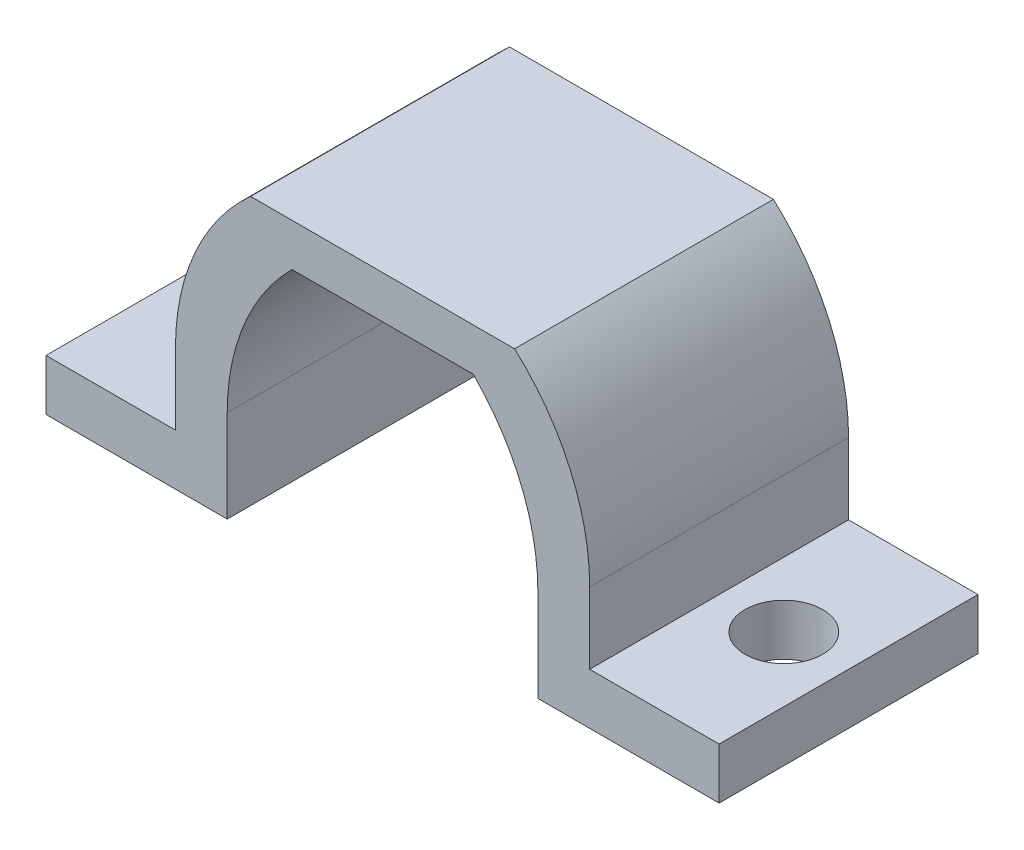
ISO-10303-21;
HEADER;
FILE_DESCRIPTION(('STEP AP214'),'2;1');
FILE_NAME('part.step','',(''),(''),'','','');
FILE_SCHEMA(('AUTOMOTIVE_DESIGN { 1 0 10303 214 1 1 1 1 }'));
ENDSEC;
DATA;
#1=APPLICATION_CONTEXT('core data for automotive mechanical design processes');
#2=APPLICATION_PROTOCOL_DEFINITION('international standard','automotive_design',2000,#1);
#3=PRODUCT_CONTEXT('',#1,'mechanical');
#4=PRODUCT('Part','Part','',(#3));
#5=PRODUCT_RELATED_PRODUCT_CATEGORY('part','',(#4));
#6=PRODUCT_DEFINITION_FORMATION('','',#4);
#7=PRODUCT_DEFINITION_CONTEXT('part definition',#1,'design');
#8=PRODUCT_DEFINITION('design','',#6,#7);
#9=PRODUCT_DEFINITION_SHAPE('','',#8);
#10=(LENGTH_UNIT() NAMED_UNIT(*) SI_UNIT(.MILLI.,.METRE.));
#11=(NAMED_UNIT(*) PLANE_ANGLE_UNIT() SI_UNIT($,.RADIAN.));
#12=(NAMED_UNIT(*) SI_UNIT($,.STERADIAN.) SOLID_ANGLE_UNIT());
#13=UNCERTAINTY_MEASURE_WITH_UNIT(LENGTH_MEASURE(1.E-05),#10,'distance_accuracy_value','');
#14=(GEOMETRIC_REPRESENTATION_CONTEXT(3) GLOBAL_UNCERTAINTY_ASSIGNED_CONTEXT((#13)) GLOBAL_UNIT_ASSIGNED_CONTEXT((#10,
#11,#12)) REPRESENTATION_CONTEXT('',''));
#15=CARTESIAN_POINT('',(0.,0.,0.));
#16=DIRECTION('',(0.,0.,1.));
#17=DIRECTION('',(1.,0.,0.));
#18=AXIS2_PLACEMENT_3D('',#15,#16,#17);
#19=CARTESIAN_POINT('',(2.1085809977943,-0.73996665713714,10.));
#20=DIRECTION('',(0.,0.,-1.));
#21=DIRECTION('',(-1.,0.,0.));
#22=AXIS2_PLACEMENT_3D('',#19,#20,#21);
#23=CYLINDRICAL_SURFACE('',#22,8.77131713758343);
#24=CARTESIAN_POINT('',(2.1085809977943,-0.73996665713714,0.));
#25=DIRECTION('',(0.,0.,1.));
#26=DIRECTION('',(-1.,0.,0.));
#27=AXIS2_PLACEMENT_3D('',#24,#25,#26);
#28=CIRCLE('',#27,8.77131713758343);
#29=CARTESIAN_POINT('',(-3.76163900518998,5.77743477630456,0.));
#30=VERTEX_POINT('',#29);
#31=CARTESIAN_POINT('',(-6.66273613978913,-0.739966657137139,0.));
#32=VERTEX_POINT('',#31);
#33=EDGE_CURVE('E194',#30,#32,#28,.T.);
#34=ORIENTED_EDGE('',*,*,#33,.T.);
#35=DIRECTION('',(0.,0.,-1.));
#36=VECTOR('',#35,1.);
#37=CARTESIAN_POINT('',(-6.66273613978913,-0.739966657137139,10.));
#38=LINE('',#37,#36);
#39=CARTESIAN_POINT('',(-6.66273613978913,-0.739966657137139,10.));
#40=VERTEX_POINT('',#39);
#41=EDGE_CURVE('E11',#40,#32,#38,.T.);
#42=ORIENTED_EDGE('',*,*,#41,.F.);
#43=CARTESIAN_POINT('',(2.1085809977943,-0.73996665713714,10.));
#44=DIRECTION('',(0.,0.,1.));
#45=DIRECTION('',(-1.,0.,0.));
#46=AXIS2_PLACEMENT_3D('',#43,#44,#45);
#47=CIRCLE('',#46,8.77131713758343);
#48=CARTESIAN_POINT('',(-3.76163900518998,5.77743477630456,10.));
#49=VERTEX_POINT('',#48);
#50=EDGE_CURVE('E240',#49,#40,#47,.T.);
#51=ORIENTED_EDGE('',*,*,#50,.F.);
#52=DIRECTION('',(0.,0.,-1.));
#53=VECTOR('',#52,1.);
#54=CARTESIAN_POINT('',(-3.76163900518998,5.77743477630456,10.));
#55=LINE('',#54,#53);
#56=EDGE_CURVE('E190',#49,#30,#55,.T.);
#57=ORIENTED_EDGE('',*,*,#56,.T.);
#58=EDGE_LOOP('',(#34,#42,#51,#57));
#59=FACE_BOUND('',#58,.T.);
#60=ADVANCED_FACE('F44',(#59),#23,.T.);
#61=CARTESIAN_POINT('',(-6.66273613978913,-0.739966657137139,10.));
#62=DIRECTION('',(1.,0.,0.));
#63=DIRECTION('',(0.,1.,0.));
#64=AXIS2_PLACEMENT_3D('',#61,#62,#63);
#65=PLANE('',#64);
#66=DIRECTION('',(0.,-1.,0.));
#67=VECTOR('',#66,1.);
#68=CARTESIAN_POINT('',(-6.66273613978913,-0.739966657137139,0.));
#69=LINE('',#68,#67);
#70=CARTESIAN_POINT('',(-6.66273613978913,-3.49323763777108,0.));
#71=VERTEX_POINT('',#70);
#72=EDGE_CURVE('E198',#32,#71,#69,.T.);
#73=ORIENTED_EDGE('',*,*,#72,.T.);
#74=DIRECTION('',(0.,0.,-1.));
#75=VECTOR('',#74,1.);
#76=CARTESIAN_POINT('',(-6.66273613978913,-3.49323763777108,10.));
#77=LINE('',#76,#75);
#78=CARTESIAN_POINT('',(-6.66273613978913,-3.49323763777108,10.));
#79=VERTEX_POINT('',#78);
#80=EDGE_CURVE('E54',#79,#71,#77,.T.);
#81=ORIENTED_EDGE('',*,*,#80,.F.);
#82=DIRECTION('',(0.,-1.,0.));
#83=VECTOR('',#82,1.);
#84=CARTESIAN_POINT('',(-6.66273613978913,-0.739966657137139,10.));
#85=LINE('',#84,#83);
#86=EDGE_CURVE('E129',#40,#79,#85,.T.);
#87=ORIENTED_EDGE('',*,*,#86,.F.);
#88=ORIENTED_EDGE('',*,*,#41,.T.);
#89=EDGE_LOOP('',(#73,#81,#87,#88));
#90=FACE_BOUND('',#89,.T.);
#91=ADVANCED_FACE('F363',(#90),#65,.F.);
#92=CARTESIAN_POINT('',(-6.66273613978913,-3.49323763777108,10.));
#93=DIRECTION('',(0.,-1.,0.));
#94=DIRECTION('',(0.,0.,-1.));
#95=AXIS2_PLACEMENT_3D('',#92,#93,#94);
#96=PLANE('',#95);
#97=CARTESIAN_POINT('',(-9.16273613978912,-3.49323763777108,5.));
#98=DIRECTION('',(0.,1.,0.));
#99=DIRECTION('',(0.,0.,1.));
#100=AXIS2_PLACEMENT_3D('',#97,#98,#99);
#101=CIRCLE('',#100,1.5);
#102=CARTESIAN_POINT('',(-9.16273613978912,-3.49323763777108,6.5));
#103=VERTEX_POINT('',#102);
#104=EDGE_CURVE('E462',#103,#103,#101,.T.);
#105=ORIENTED_EDGE('',*,*,#104,.F.);
#106=EDGE_LOOP('',(#105));
#107=FACE_BOUND('',#106,.T.);
#108=DIRECTION('',(-1.,0.,0.));
#109=VECTOR('',#108,1.);
#110=CARTESIAN_POINT('',(-6.66273613978913,-3.49323763777108,0.));
#111=LINE('',#110,#109);
#112=CARTESIAN_POINT('',(-11.6627361397891,-3.49323763777108,0.));
#113=VERTEX_POINT('',#112);
#114=EDGE_CURVE('E201',#71,#113,#111,.T.);
#115=ORIENTED_EDGE('',*,*,#114,.T.);
#116=DIRECTION('',(0.,0.,-1.));
#117=VECTOR('',#116,1.);
#118=CARTESIAN_POINT('',(-11.6627361397891,-3.49323763777108,10.));
#119=LINE('',#118,#117);
#120=CARTESIAN_POINT('',(-11.6627361397891,-3.49323763777108,10.));
#121=VERTEX_POINT('',#120);
#122=EDGE_CURVE('E283',#121,#113,#119,.T.);
#123=ORIENTED_EDGE('',*,*,#122,.F.);
#124=DIRECTION('',(-1.,0.,0.));
#125=VECTOR('',#124,1.);
#126=CARTESIAN_POINT('',(-6.66273613978913,-3.49323763777108,10.));
#127=LINE('',#126,#125);
#128=EDGE_CURVE('E294',#79,#121,#127,.T.);
#129=ORIENTED_EDGE('',*,*,#128,.F.);
#130=ORIENTED_EDGE('',*,*,#80,.T.);
#131=EDGE_LOOP('',(#115,#123,#129,#130));
#132=FACE_BOUND('',#131,.T.);
#133=ADVANCED_FACE('F292',(#107,#132),#96,.F.);
#134=CARTESIAN_POINT('',(-11.6627361397891,-3.49323763777108,10.));
#135=DIRECTION('',(1.,0.,0.));
#136=DIRECTION('',(0.,1.,0.));
#137=AXIS2_PLACEMENT_3D('',#134,#135,#136);
#138=PLANE('',#137);
#139=DIRECTION('',(0.,-1.,0.));
#140=VECTOR('',#139,1.);
#141=CARTESIAN_POINT('',(-11.6627361397891,-3.49323763777108,0.));
#142=LINE('',#141,#140);
#143=CARTESIAN_POINT('',(-11.6627361397891,-5.46917917370583,0.));
#144=VERTEX_POINT('',#143);
#145=EDGE_CURVE('E204',#113,#144,#142,.T.);
#146=ORIENTED_EDGE('',*,*,#145,.T.);
#147=DIRECTION('',(0.,0.,-1.));
#148=VECTOR('',#147,1.);
#149=CARTESIAN_POINT('',(-11.6627361397891,-5.46917917370583,10.));
#150=LINE('',#149,#148);
#151=CARTESIAN_POINT('',(-11.6627361397891,-5.46917917370583,10.));
#152=VERTEX_POINT('',#151);
#153=EDGE_CURVE('E279',#152,#144,#150,.T.);
#154=ORIENTED_EDGE('',*,*,#153,.F.);
#155=DIRECTION('',(0.,-1.,0.));
#156=VECTOR('',#155,1.);
#157=CARTESIAN_POINT('',(-11.6627361397891,-3.49323763777108,10.));
#158=LINE('',#157,#156);
#159=EDGE_CURVE('E313',#121,#152,#158,.T.);
#160=ORIENTED_EDGE('',*,*,#159,.F.);
#161=ORIENTED_EDGE('',*,*,#122,.T.);
#162=EDGE_LOOP('',(#146,#154,#160,#161));
#163=FACE_BOUND('',#162,.T.);
#164=ADVANCED_FACE('F303',(#163),#138,.F.);
#165=CARTESIAN_POINT('',(-4.66273613978913,-5.46917917370583,10.));
#166=DIRECTION('',(0.,1.,0.));
#167=DIRECTION('',(-1.,0.,0.));
#168=AXIS2_PLACEMENT_3D('',#165,#166,#167);
#169=PLANE('',#168);
#170=CARTESIAN_POINT('',(-9.16273613978912,-5.46917917370583,5.));
#171=DIRECTION('',(0.,1.,0.));
#172=DIRECTION('',(-1.,0.,0.));
#173=AXIS2_PLACEMENT_3D('',#170,#171,#172);
#174=CIRCLE('',#173,1.5);
#175=CARTESIAN_POINT('',(-10.6627361397891,-5.46917917370583,5.));
#176=VERTEX_POINT('',#175);
#177=EDGE_CURVE('E47',#176,#176,#174,.T.);
#178=ORIENTED_EDGE('',*,*,#177,.T.);
#179=EDGE_LOOP('',(#178));
#180=FACE_BOUND('',#179,.T.);
#181=DIRECTION('',(1.,0.,0.));
#182=VECTOR('',#181,1.);
#183=CARTESIAN_POINT('',(-4.66273613978913,-5.46917917370583,0.));
#184=LINE('',#183,#182);
#185=CARTESIAN_POINT('',(-4.66273613978913,-5.46917917370583,0.));
#186=VERTEX_POINT('',#185);
#187=EDGE_CURVE('E207',#144,#186,#184,.T.);
#188=ORIENTED_EDGE('',*,*,#187,.T.);
#189=DIRECTION('',(0.,0.,-1.));
#190=VECTOR('',#189,1.);
#191=CARTESIAN_POINT('',(-4.66273613978913,-5.46917917370583,10.));
#192=LINE('',#191,#190);
#193=CARTESIAN_POINT('',(-4.66273613978913,-5.46917917370583,10.));
#194=VERTEX_POINT('',#193);
#195=EDGE_CURVE('E275',#194,#186,#192,.T.);
#196=ORIENTED_EDGE('',*,*,#195,.F.);
#197=DIRECTION('',(1.,0.,0.));
#198=VECTOR('',#197,1.);
#199=CARTESIAN_POINT('',(-4.66273613978913,-5.46917917370583,10.));
#200=LINE('',#199,#198);
#201=EDGE_CURVE('E309',#152,#194,#200,.T.);
#202=ORIENTED_EDGE('',*,*,#201,.F.);
#203=ORIENTED_EDGE('',*,*,#153,.T.);
#204=EDGE_LOOP('',(#188,#196,#202,#203));
#205=FACE_BOUND('',#204,.T.);
#206=ADVANCED_FACE('F307',(#180,#205),#169,.F.);
#207=CARTESIAN_POINT('',(-4.66273613978913,-5.46917917370583,10.));
#208=DIRECTION('',(-1.,0.,0.));
#209=DIRECTION('',(0.,0.,1.));
#210=AXIS2_PLACEMENT_3D('',#207,#208,#209);
#211=PLANE('',#210);
#212=DIRECTION('',(0.,1.,0.));
#213=VECTOR('',#212,1.);
#214=CARTESIAN_POINT('',(-4.66273613978913,-5.46917917370583,0.));
#215=LINE('',#214,#213);
#216=CARTESIAN_POINT('',(-4.66273613978913,-1.9075561157816,0.));
#217=VERTEX_POINT('',#216);
#218=EDGE_CURVE('E210',#186,#217,#215,.T.);
#219=ORIENTED_EDGE('',*,*,#218,.T.);
#220=DIRECTION('',(0.,0.,-1.));
#221=VECTOR('',#220,1.);
#222=CARTESIAN_POINT('',(-4.66273613978913,-1.9075561157816,10.));
#223=LINE('',#222,#221);
#224=CARTESIAN_POINT('',(-4.66273613978913,-1.9075561157816,10.));
#225=VERTEX_POINT('',#224);
#226=EDGE_CURVE('E271',#225,#217,#223,.T.);
#227=ORIENTED_EDGE('',*,*,#226,.F.);
#228=DIRECTION('',(0.,1.,0.));
#229=VECTOR('',#228,1.);
#230=CARTESIAN_POINT('',(-4.66273613978913,-5.46917917370583,10.));
#231=LINE('',#230,#229);
#232=EDGE_CURVE('E312',#194,#225,#231,.T.);
#233=ORIENTED_EDGE('',*,*,#232,.F.);
#234=ORIENTED_EDGE('',*,*,#195,.T.);
#235=EDGE_LOOP('',(#219,#227,#233,#234));
#236=FACE_BOUND('',#235,.T.);
#237=ADVANCED_FACE('F377',(#236),#211,.F.);
#238=CARTESIAN_POINT('',(3.87966307912934,-1.9075561157816,10.));
#239=DIRECTION('',(0.,0.,-1.));
#240=DIRECTION('',(-1.,0.,0.));
#241=AXIS2_PLACEMENT_3D('',#238,#239,#240);
#242=CYLINDRICAL_SURFACE('',#241,8.54239921891846);
#243=CARTESIAN_POINT('',(3.87966307912934,-1.9075561157816,0.));
#244=DIRECTION('',(0.,0.,-1.));
#245=DIRECTION('',(-1.,0.,0.));
#246=AXIS2_PLACEMENT_3D('',#243,#244,#245);
#247=CIRCLE('',#246,8.54239921891846);
#248=CARTESIAN_POINT('',(-2.16273613978913,4.13082082629417,0.));
#249=VERTEX_POINT('',#248);
#250=EDGE_CURVE('E213',#217,#249,#247,.T.);
#251=ORIENTED_EDGE('',*,*,#250,.T.);
#252=DIRECTION('',(0.,0.,-1.));
#253=VECTOR('',#252,1.);
#254=CARTESIAN_POINT('',(-2.16273613978913,4.13082082629417,10.));
#255=LINE('',#254,#253);
#256=CARTESIAN_POINT('',(-2.16273613978913,4.13082082629417,10.));
#257=VERTEX_POINT('',#256);
#258=EDGE_CURVE('E267',#257,#249,#255,.T.);
#259=ORIENTED_EDGE('',*,*,#258,.F.);
#260=CARTESIAN_POINT('',(3.87966307912934,-1.9075561157816,10.));
#261=DIRECTION('',(0.,0.,-1.));
#262=DIRECTION('',(-1.,0.,0.));
#263=AXIS2_PLACEMENT_3D('',#260,#261,#262);
#264=CIRCLE('',#263,8.54239921891846);
#265=EDGE_CURVE('E317',#225,#257,#264,.T.);
#266=ORIENTED_EDGE('',*,*,#265,.F.);
#267=ORIENTED_EDGE('',*,*,#226,.T.);
#268=EDGE_LOOP('',(#251,#259,#266,#267));
#269=FACE_BOUND('',#268,.T.);
#270=ADVANCED_FACE('F381',(#269),#242,.F.);
#271=CARTESIAN_POINT('',(-2.16273613978913,4.13082082629417,10.));
#272=DIRECTION('',(0.,1.,0.));
#273=DIRECTION('',(0.,0.,1.));
#274=AXIS2_PLACEMENT_3D('',#271,#272,#273);
#275=PLANE('',#274);
#276=DIRECTION('',(1.,0.,0.));
#277=VECTOR('',#276,1.);
#278=CARTESIAN_POINT('',(-2.16273613978913,4.13082082629417,0.));
#279=LINE('',#278,#277);
#280=CARTESIAN_POINT('',(4.83726386021087,4.13082082629417,0.));
#281=VERTEX_POINT('',#280);
#282=EDGE_CURVE('E216',#249,#281,#279,.T.);
#283=ORIENTED_EDGE('',*,*,#282,.T.);
#284=DIRECTION('',(0.,0.,-1.));
#285=VECTOR('',#284,1.);
#286=CARTESIAN_POINT('',(4.83726386021087,4.13082082629417,10.));
#287=LINE('',#286,#285);
#288=CARTESIAN_POINT('',(4.83726386021087,4.13082082629417,10.));
#289=VERTEX_POINT('',#288);
#290=EDGE_CURVE('E263',#289,#281,#287,.T.);
#291=ORIENTED_EDGE('',*,*,#290,.F.);
#292=DIRECTION('',(1.,0.,0.));
#293=VECTOR('',#292,1.);
#294=CARTESIAN_POINT('',(-2.16273613978913,4.13082082629417,10.));
#295=LINE('',#294,#293);
#296=EDGE_CURVE('E324',#257,#289,#295,.T.);
#297=ORIENTED_EDGE('',*,*,#296,.F.);
#298=ORIENTED_EDGE('',*,*,#258,.T.);
#299=EDGE_LOOP('',(#283,#291,#297,#298));
#300=FACE_BOUND('',#299,.T.);
#301=ADVANCED_FACE('F385',(#300),#275,.F.);
#302=CARTESIAN_POINT('',(-1.20513535870759,-1.9075561157816,10.));
#303=DIRECTION('',(0.,0.,-1.));
#304=DIRECTION('',(-1.,0.,0.));
#305=AXIS2_PLACEMENT_3D('',#302,#303,#304);
#306=CYLINDRICAL_SURFACE('',#305,8.54239921891846);
#307=CARTESIAN_POINT('',(-1.20513535870759,-1.9075561157816,0.));
#308=DIRECTION('',(0.,0.,-1.));
#309=DIRECTION('',(1.,0.,0.));
#310=AXIS2_PLACEMENT_3D('',#307,#308,#309);
#311=CIRCLE('',#310,8.54239921891846);
#312=CARTESIAN_POINT('',(7.33726386021087,-1.9075561157816,0.));
#313=VERTEX_POINT('',#312);
#314=EDGE_CURVE('E219',#281,#313,#311,.T.);
#315=ORIENTED_EDGE('',*,*,#314,.T.);
#316=DIRECTION('',(0.,0.,-1.));
#317=VECTOR('',#316,1.);
#318=CARTESIAN_POINT('',(7.33726386021087,-1.9075561157816,10.));
#319=LINE('',#318,#317);
#320=CARTESIAN_POINT('',(7.33726386021087,-1.9075561157816,10.));
#321=VERTEX_POINT('',#320);
#322=EDGE_CURVE('E259',#321,#313,#319,.T.);
#323=ORIENTED_EDGE('',*,*,#322,.F.);
#324=CARTESIAN_POINT('',(-1.20513535870759,-1.9075561157816,10.));
#325=DIRECTION('',(0.,0.,-1.));
#326=DIRECTION('',(1.,0.,0.));
#327=AXIS2_PLACEMENT_3D('',#324,#325,#326);
#328=CIRCLE('',#327,8.54239921891846);
#329=EDGE_CURVE('E327',#289,#321,#328,.T.);
#330=ORIENTED_EDGE('',*,*,#329,.F.);
#331=ORIENTED_EDGE('',*,*,#290,.T.);
#332=EDGE_LOOP('',(#315,#323,#330,#331));
#333=FACE_BOUND('',#332,.T.);
#334=ADVANCED_FACE('F389',(#333),#306,.F.);
#335=CARTESIAN_POINT('',(7.33726386021087,-5.46917917370583,10.));
#336=DIRECTION('',(1.,0.,0.));
#337=DIRECTION('',(0.,0.,-1.));
#338=AXIS2_PLACEMENT_3D('',#335,#336,#337);
#339=PLANE('',#338);
#340=DIRECTION('',(0.,-1.,0.));
#341=VECTOR('',#340,1.);
#342=CARTESIAN_POINT('',(7.33726386021087,-5.46917917370583,0.));
#343=LINE('',#342,#341);
#344=CARTESIAN_POINT('',(7.33726386021087,-5.46917917370583,0.));
#345=VERTEX_POINT('',#344);
#346=EDGE_CURVE('E222',#313,#345,#343,.T.);
#347=ORIENTED_EDGE('',*,*,#346,.T.);
#348=DIRECTION('',(0.,0.,-1.));
#349=VECTOR('',#348,1.);
#350=CARTESIAN_POINT('',(7.33726386021087,-5.46917917370583,10.));
#351=LINE('',#350,#349);
#352=CARTESIAN_POINT('',(7.33726386021087,-5.46917917370583,10.));
#353=VERTEX_POINT('',#352);
#354=EDGE_CURVE('E255',#353,#345,#351,.T.);
#355=ORIENTED_EDGE('',*,*,#354,.F.);
#356=DIRECTION('',(0.,-1.,0.));
#357=VECTOR('',#356,1.);
#358=CARTESIAN_POINT('',(7.33726386021087,-5.46917917370583,10.));
#359=LINE('',#358,#357);
#360=EDGE_CURVE('E330',#321,#353,#359,.T.);
#361=ORIENTED_EDGE('',*,*,#360,.F.);
#362=ORIENTED_EDGE('',*,*,#322,.T.);
#363=EDGE_LOOP('',(#347,#355,#361,#362));
#364=FACE_BOUND('',#363,.T.);
#365=ADVANCED_FACE('F393',(#364),#339,.F.);
#366=CARTESIAN_POINT('',(7.33726386021087,-5.46917917370583,10.));
#367=DIRECTION('',(0.,1.,0.));
#368=DIRECTION('',(-1.,0.,0.));
#369=AXIS2_PLACEMENT_3D('',#366,#367,#368);
#370=PLANE('',#369);
#371=CARTESIAN_POINT('',(11.8372638602109,-5.46917917370583,5.));
#372=DIRECTION('',(0.,1.,0.));
#373=DIRECTION('',(-1.,0.,0.));
#374=AXIS2_PLACEMENT_3D('',#371,#372,#373);
#375=CIRCLE('',#374,1.5);
#376=CARTESIAN_POINT('',(10.3372638602109,-5.46917917370583,5.));
#377=VERTEX_POINT('',#376);
#378=EDGE_CURVE('E466',#377,#377,#375,.T.);
#379=ORIENTED_EDGE('',*,*,#378,.T.);
#380=EDGE_LOOP('',(#379));
#381=FACE_BOUND('',#380,.T.);
#382=DIRECTION('',(1.,0.,0.));
#383=VECTOR('',#382,1.);
#384=CARTESIAN_POINT('',(7.33726386021087,-5.46917917370583,0.));
#385=LINE('',#384,#383);
#386=CARTESIAN_POINT('',(14.3372638602109,-5.46917917370583,0.));
#387=VERTEX_POINT('',#386);
#388=EDGE_CURVE('E225',#345,#387,#385,.T.);
#389=ORIENTED_EDGE('',*,*,#388,.T.);
#390=DIRECTION('',(0.,0.,-1.));
#391=VECTOR('',#390,1.);
#392=CARTESIAN_POINT('',(14.3372638602109,-5.46917917370583,10.));
#393=LINE('',#392,#391);
#394=CARTESIAN_POINT('',(14.3372638602109,-5.46917917370583,10.));
#395=VERTEX_POINT('',#394);
#396=EDGE_CURVE('E251',#395,#387,#393,.T.);
#397=ORIENTED_EDGE('',*,*,#396,.F.);
#398=DIRECTION('',(1.,0.,0.));
#399=VECTOR('',#398,1.);
#400=CARTESIAN_POINT('',(7.33726386021087,-5.46917917370583,10.));
#401=LINE('',#400,#399);
#402=EDGE_CURVE('E333',#353,#395,#401,.T.);
#403=ORIENTED_EDGE('',*,*,#402,.F.);
#404=ORIENTED_EDGE('',*,*,#354,.T.);
#405=EDGE_LOOP('',(#389,#397,#403,#404));
#406=FACE_BOUND('',#405,.T.);
#407=ADVANCED_FACE('F397',(#381,#406),#370,.F.);
#408=CARTESIAN_POINT('',(14.3372638602109,-3.49323763777108,10.));
#409=DIRECTION('',(-1.,0.,0.));
#410=DIRECTION('',(0.,-1.,0.));
#411=AXIS2_PLACEMENT_3D('',#408,#409,#410);
#412=PLANE('',#411);
#413=DIRECTION('',(0.,1.,0.));
#414=VECTOR('',#413,1.);
#415=CARTESIAN_POINT('',(14.3372638602109,-3.49323763777108,0.));
#416=LINE('',#415,#414);
#417=CARTESIAN_POINT('',(14.3372638602109,-3.49323763777108,0.));
#418=VERTEX_POINT('',#417);
#419=EDGE_CURVE('E228',#387,#418,#416,.T.);
#420=ORIENTED_EDGE('',*,*,#419,.T.);
#421=DIRECTION('',(0.,0.,-1.));
#422=VECTOR('',#421,1.);
#423=CARTESIAN_POINT('',(14.3372638602109,-3.49323763777108,10.));
#424=LINE('',#423,#422);
#425=CARTESIAN_POINT('',(14.3372638602109,-3.49323763777108,10.));
#426=VERTEX_POINT('',#425);
#427=EDGE_CURVE('E247',#426,#418,#424,.T.);
#428=ORIENTED_EDGE('',*,*,#427,.F.);
#429=DIRECTION('',(0.,1.,0.));
#430=VECTOR('',#429,1.);
#431=CARTESIAN_POINT('',(14.3372638602109,-3.49323763777108,10.));
#432=LINE('',#431,#430);
#433=EDGE_CURVE('E336',#395,#426,#432,.T.);
#434=ORIENTED_EDGE('',*,*,#433,.F.);
#435=ORIENTED_EDGE('',*,*,#396,.T.);
#436=EDGE_LOOP('',(#420,#428,#434,#435));
#437=FACE_BOUND('',#436,.T.);
#438=ADVANCED_FACE('F344',(#437),#412,.F.);
#439=CARTESIAN_POINT('',(9.33726386021087,-3.49323763777108,10.));
#440=DIRECTION('',(0.,-1.,0.));
#441=DIRECTION('',(0.,0.,-1.));
#442=AXIS2_PLACEMENT_3D('',#439,#440,#441);
#443=PLANE('',#442);
#444=CARTESIAN_POINT('',(11.8372638602109,-3.49323763777108,5.));
#445=DIRECTION('',(0.,1.,0.));
#446=DIRECTION('',(0.,0.,-1.));
#447=AXIS2_PLACEMENT_3D('',#444,#445,#446);
#448=CIRCLE('',#447,1.5);
#449=CARTESIAN_POINT('',(11.8372638602109,-3.49323763777108,3.5));
#450=VERTEX_POINT('',#449);
#451=EDGE_CURVE('E472',#450,#450,#448,.T.);
#452=ORIENTED_EDGE('',*,*,#451,.F.);
#453=EDGE_LOOP('',(#452));
#454=FACE_BOUND('',#453,.T.);
#455=DIRECTION('',(-1.,0.,0.));
#456=VECTOR('',#455,1.);
#457=CARTESIAN_POINT('',(9.33726386021087,-3.49323763777108,0.));
#458=LINE('',#457,#456);
#459=CARTESIAN_POINT('',(9.33726386021087,-3.49323763777108,0.));
#460=VERTEX_POINT('',#459);
#461=EDGE_CURVE('E231',#418,#460,#458,.T.);
#462=ORIENTED_EDGE('',*,*,#461,.T.);
#463=DIRECTION('',(0.,0.,-1.));
#464=VECTOR('',#463,1.);
#465=CARTESIAN_POINT('',(9.33726386021087,-3.49323763777108,10.));
#466=LINE('',#465,#464);
#467=CARTESIAN_POINT('',(9.33726386021087,-3.49323763777108,10.));
#468=VERTEX_POINT('',#467);
#469=EDGE_CURVE('E183',#468,#460,#466,.T.);
#470=ORIENTED_EDGE('',*,*,#469,.F.);
#471=DIRECTION('',(-1.,0.,0.));
#472=VECTOR('',#471,1.);
#473=CARTESIAN_POINT('',(9.33726386021087,-3.49323763777108,10.));
#474=LINE('',#473,#472);
#475=EDGE_CURVE('E172',#426,#468,#474,.T.);
#476=ORIENTED_EDGE('',*,*,#475,.F.);
#477=ORIENTED_EDGE('',*,*,#427,.T.);
#478=EDGE_LOOP('',(#462,#470,#476,#477));
#479=FACE_BOUND('',#478,.T.);
#480=ADVANCED_FACE('F348',(#454,#479),#443,.F.);
#481=CARTESIAN_POINT('',(9.33726386021088,-0.739966657137139,10.));
#482=DIRECTION('',(-1.,0.,0.));
#483=DIRECTION('',(0.,-1.,0.));
#484=AXIS2_PLACEMENT_3D('',#481,#482,#483);
#485=PLANE('',#484);
#486=DIRECTION('',(0.,1.,0.));
#487=VECTOR('',#486,1.);
#488=CARTESIAN_POINT('',(9.33726386021088,-0.739966657137139,0.));
#489=LINE('',#488,#487);
#490=CARTESIAN_POINT('',(9.33726386021088,-0.739966657137139,0.));
#491=VERTEX_POINT('',#490);
#492=EDGE_CURVE('E181',#460,#491,#489,.T.);
#493=ORIENTED_EDGE('',*,*,#492,.T.);
#494=DIRECTION('',(0.,0.,-1.));
#495=VECTOR('',#494,1.);
#496=CARTESIAN_POINT('',(9.33726386021088,-0.739966657137139,10.));
#497=LINE('',#496,#495);
#498=CARTESIAN_POINT('',(9.33726386021088,-0.739966657137139,10.));
#499=VERTEX_POINT('',#498);
#500=EDGE_CURVE('E178',#499,#491,#497,.T.);
#501=ORIENTED_EDGE('',*,*,#500,.F.);
#502=DIRECTION('',(0.,1.,0.));
#503=VECTOR('',#502,1.);
#504=CARTESIAN_POINT('',(9.33726386021088,-0.739966657137139,10.));
#505=LINE('',#504,#503);
#506=EDGE_CURVE('E166',#468,#499,#505,.T.);
#507=ORIENTED_EDGE('',*,*,#506,.F.);
#508=ORIENTED_EDGE('',*,*,#469,.T.);
#509=EDGE_LOOP('',(#493,#501,#507,#508));
#510=FACE_BOUND('',#509,.T.);
#511=ADVANCED_FACE('F179',(#510),#485,.F.);
#512=CARTESIAN_POINT('',(0.565946722627444,-0.73996665713714,10.));
#513=DIRECTION('',(0.,0.,-1.));
#514=DIRECTION('',(-1.,0.,0.));
#515=AXIS2_PLACEMENT_3D('',#512,#513,#514);
#516=CYLINDRICAL_SURFACE('',#515,8.77131713758343);
#517=CARTESIAN_POINT('',(0.565946722627444,-0.73996665713714,0.));
#518=DIRECTION('',(0.,0.,1.));
#519=DIRECTION('',(1.,0.,0.));
#520=AXIS2_PLACEMENT_3D('',#517,#518,#519);
#521=CIRCLE('',#520,8.77131713758343);
#522=CARTESIAN_POINT('',(6.43616672561173,5.77743477630456,0.));
#523=VERTEX_POINT('',#522);
#524=EDGE_CURVE('E115',#491,#523,#521,.T.);
#525=ORIENTED_EDGE('',*,*,#524,.T.);
#526=DIRECTION('',(0.,0.,-1.));
#527=VECTOR('',#526,1.);
#528=CARTESIAN_POINT('',(6.43616672561173,5.77743477630456,10.));
#529=LINE('',#528,#527);
#530=CARTESIAN_POINT('',(6.43616672561173,5.77743477630456,10.));
#531=VERTEX_POINT('',#530);
#532=EDGE_CURVE('E184',#531,#523,#529,.T.);
#533=ORIENTED_EDGE('',*,*,#532,.F.);
#534=CARTESIAN_POINT('',(0.565946722627444,-0.73996665713714,10.));
#535=DIRECTION('',(0.,0.,1.));
#536=DIRECTION('',(1.,0.,0.));
#537=AXIS2_PLACEMENT_3D('',#534,#535,#536);
#538=CIRCLE('',#537,8.77131713758343);
#539=EDGE_CURVE('E170',#499,#531,#538,.T.);
#540=ORIENTED_EDGE('',*,*,#539,.F.);
#541=ORIENTED_EDGE('',*,*,#500,.T.);
#542=EDGE_LOOP('',(#525,#533,#540,#541));
#543=FACE_BOUND('',#542,.T.);
#544=ADVANCED_FACE('F186',(#543),#516,.T.);
#545=CARTESIAN_POINT('',(-3.76163900518998,5.77743477630456,10.));
#546=DIRECTION('',(0.,-1.,0.));
#547=DIRECTION('',(0.,0.,-1.));
#548=AXIS2_PLACEMENT_3D('',#545,#546,#547);
#549=PLANE('',#548);
#550=DIRECTION('',(-1.,0.,0.));
#551=VECTOR('',#550,1.);
#552=CARTESIAN_POINT('',(-3.76163900518998,5.77743477630456,0.));
#553=LINE('',#552,#551);
#554=EDGE_CURVE('E121',#523,#30,#553,.T.);
#555=ORIENTED_EDGE('',*,*,#554,.T.);
#556=ORIENTED_EDGE('',*,*,#56,.F.);
#557=DIRECTION('',(-1.,0.,0.));
#558=VECTOR('',#557,1.);
#559=CARTESIAN_POINT('',(-3.76163900518998,5.77743477630456,10.));
#560=LINE('',#559,#558);
#561=EDGE_CURVE('E62',#531,#49,#560,.T.);
#562=ORIENTED_EDGE('',*,*,#561,.F.);
#563=ORIENTED_EDGE('',*,*,#532,.T.);
#564=EDGE_LOOP('',(#555,#556,#562,#563));
#565=FACE_BOUND('',#564,.T.);
#566=ADVANCED_FACE('F352',(#565),#549,.F.);
#567=CARTESIAN_POINT('',(2.1085809977943,-0.73996665713714,10.));
#568=DIRECTION('',(0.,0.,-1.));
#569=DIRECTION('',(-1.,0.,0.));
#570=AXIS2_PLACEMENT_3D('',#567,#568,#569);
#571=PLANE('',#570);
#572=ORIENTED_EDGE('',*,*,#50,.T.);
#573=ORIENTED_EDGE('',*,*,#86,.T.);
#574=ORIENTED_EDGE('',*,*,#128,.T.);
#575=ORIENTED_EDGE('',*,*,#159,.T.);
#576=ORIENTED_EDGE('',*,*,#201,.T.);
#577=ORIENTED_EDGE('',*,*,#232,.T.);
#578=ORIENTED_EDGE('',*,*,#265,.T.);
#579=ORIENTED_EDGE('',*,*,#296,.T.);
#580=ORIENTED_EDGE('',*,*,#329,.T.);
#581=ORIENTED_EDGE('',*,*,#360,.T.);
#582=ORIENTED_EDGE('',*,*,#402,.T.);
#583=ORIENTED_EDGE('',*,*,#433,.T.);
#584=ORIENTED_EDGE('',*,*,#475,.T.);
#585=ORIENTED_EDGE('',*,*,#506,.T.);
#586=ORIENTED_EDGE('',*,*,#539,.T.);
#587=ORIENTED_EDGE('',*,*,#561,.T.);
#588=EDGE_LOOP('',(#572,#573,#574,#575,#576,#577,#578,#579,#580,#581,#582,#583,#584,#585,#586,#587));
#589=FACE_BOUND('',#588,.T.);
#590=ADVANCED_FACE('F168',(#589),#571,.F.);
#591=CARTESIAN_POINT('',(2.1085809977943,-0.73996665713714,0.));
#592=DIRECTION('',(0.,0.,-1.));
#593=DIRECTION('',(-1.,0.,0.));
#594=AXIS2_PLACEMENT_3D('',#591,#592,#593);
#595=PLANE('',#594);
#596=ORIENTED_EDGE('',*,*,#33,.F.);
#597=ORIENTED_EDGE('',*,*,#554,.F.);
#598=ORIENTED_EDGE('',*,*,#524,.F.);
#599=ORIENTED_EDGE('',*,*,#492,.F.);
#600=ORIENTED_EDGE('',*,*,#461,.F.);
#601=ORIENTED_EDGE('',*,*,#419,.F.);
#602=ORIENTED_EDGE('',*,*,#388,.F.);
#603=ORIENTED_EDGE('',*,*,#346,.F.);
#604=ORIENTED_EDGE('',*,*,#314,.F.);
#605=ORIENTED_EDGE('',*,*,#282,.F.);
#606=ORIENTED_EDGE('',*,*,#250,.F.);
#607=ORIENTED_EDGE('',*,*,#218,.F.);
#608=ORIENTED_EDGE('',*,*,#187,.F.);
#609=ORIENTED_EDGE('',*,*,#145,.F.);
#610=ORIENTED_EDGE('',*,*,#114,.F.);
#611=ORIENTED_EDGE('',*,*,#72,.F.);
#612=EDGE_LOOP('',(#596,#597,#598,#599,#600,#601,#602,#603,#604,#605,#606,#607,#608,#609,#610,#611));
#613=FACE_BOUND('',#612,.T.);
#614=ADVANCED_FACE('F298',(#613),#595,.T.);
#615=CARTESIAN_POINT('',(11.8372638602109,-13.4932376377711,5.));
#616=DIRECTION('',(0.,1.,0.));
#617=DIRECTION('',(0.,0.,1.));
#618=AXIS2_PLACEMENT_3D('',#615,#616,#617);
#619=CYLINDRICAL_SURFACE('',#618,1.5);
#620=ORIENTED_EDGE('',*,*,#451,.T.);
#621=EDGE_LOOP('',(#620));
#622=FACE_BOUND('',#621,.T.);
#623=ORIENTED_EDGE('',*,*,#378,.F.);
#624=EDGE_LOOP('',(#623));
#625=FACE_BOUND('',#624,.T.);
#626=ADVANCED_FACE('F438',(#622,#625),#619,.F.);
#627=CARTESIAN_POINT('',(-9.16273613978912,-13.4932376377711,5.));
#628=DIRECTION('',(0.,1.,0.));
#629=DIRECTION('',(0.,0.,1.));
#630=AXIS2_PLACEMENT_3D('',#627,#628,#629);
#631=CYLINDRICAL_SURFACE('',#630,1.5);
#632=ORIENTED_EDGE('',*,*,#104,.T.);
#633=EDGE_LOOP('',(#632));
#634=FACE_BOUND('',#633,.T.);
#635=ORIENTED_EDGE('',*,*,#177,.F.);
#636=EDGE_LOOP('',(#635));
#637=FACE_BOUND('',#636,.T.);
#638=ADVANCED_FACE('F446',(#634,#637),#631,.F.);
#639=CLOSED_SHELL('',(#60,#91,#133,#164,#206,#237,#270,#301,#334,#365,#407,#438,#480,#511,#544,
#566,#590,#614,#626,#638));
#640=MANIFOLD_SOLID_BREP('B2',#639);
#641=ADVANCED_BREP_SHAPE_REPRESENTATION('',(#18,#640),#14);
#642=SHAPE_DEFINITION_REPRESENTATION(#9,#641);
ENDSEC;
END-ISO-10303-21;
